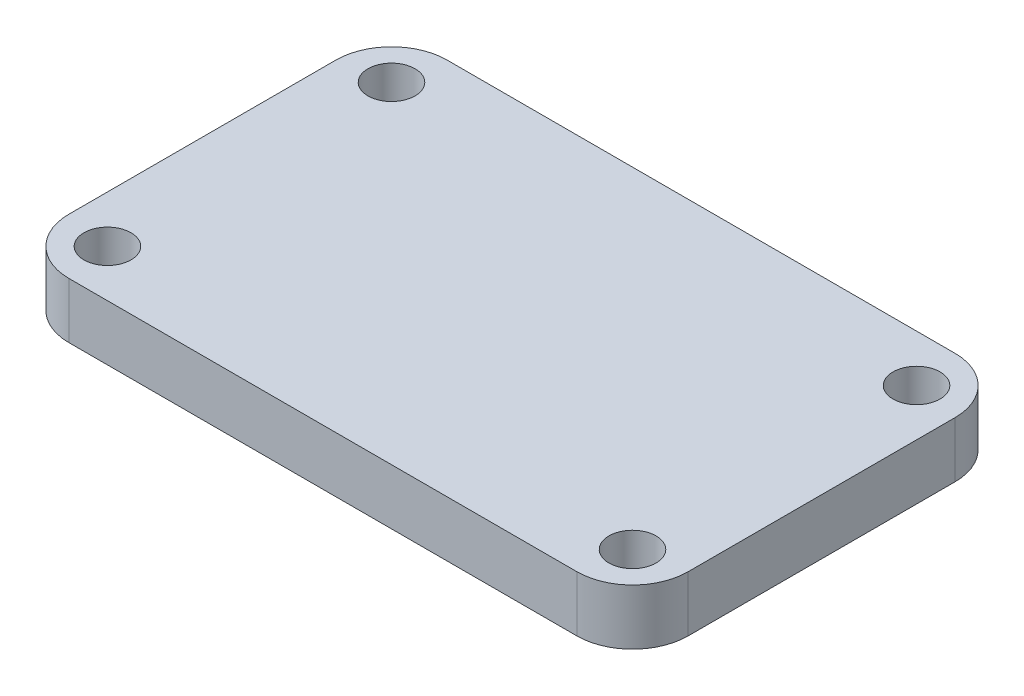
ISO-10303-21;
HEADER;
FILE_DESCRIPTION(('STEP AP214'),'2;1');
FILE_NAME('part.step','',(''),(''),'','','');
FILE_SCHEMA(('AUTOMOTIVE_DESIGN { 1 0 10303 214 1 1 1 1 }'));
ENDSEC;
DATA;
#1=APPLICATION_CONTEXT('core data for automotive mechanical design processes');
#2=APPLICATION_PROTOCOL_DEFINITION('international standard','automotive_design',2000,#1);
#3=PRODUCT_CONTEXT('',#1,'mechanical');
#4=PRODUCT('Part','Part','',(#3));
#5=PRODUCT_RELATED_PRODUCT_CATEGORY('part','',(#4));
#6=PRODUCT_DEFINITION_FORMATION('','',#4);
#7=PRODUCT_DEFINITION_CONTEXT('part definition',#1,'design');
#8=PRODUCT_DEFINITION('design','',#6,#7);
#9=PRODUCT_DEFINITION_SHAPE('','',#8);
#10=(LENGTH_UNIT() NAMED_UNIT(*) SI_UNIT(.MILLI.,.METRE.));
#11=(NAMED_UNIT(*) PLANE_ANGLE_UNIT() SI_UNIT($,.RADIAN.));
#12=(NAMED_UNIT(*) SI_UNIT($,.STERADIAN.) SOLID_ANGLE_UNIT());
#13=UNCERTAINTY_MEASURE_WITH_UNIT(LENGTH_MEASURE(1.E-05),#10,'distance_accuracy_value','');
#14=(GEOMETRIC_REPRESENTATION_CONTEXT(3) GLOBAL_UNCERTAINTY_ASSIGNED_CONTEXT((#13)) GLOBAL_UNIT_ASSIGNED_CONTEXT((#10,
#11,#12)) REPRESENTATION_CONTEXT('',''));
#15=CARTESIAN_POINT('',(0.,0.,0.));
#16=DIRECTION('',(0.,0.,1.));
#17=DIRECTION('',(1.,0.,0.));
#18=AXIS2_PLACEMENT_3D('',#15,#16,#17);
#19=CARTESIAN_POINT('',(33.3999999999999,3.,0.));
#20=DIRECTION('',(0.,0.,-1.));
#21=DIRECTION('',(-1.,0.,0.));
#22=AXIS2_PLACEMENT_3D('',#19,#20,#21);
#23=PLANE('',#22);
#24=DIRECTION('',(1.,0.,0.));
#25=VECTOR('',#24,1.);
#26=CARTESIAN_POINT('',(33.3999999999999,0.,0.));
#27=LINE('',#26,#25);
#28=CARTESIAN_POINT('',(2.99999999999999,0.,0.));
#29=VERTEX_POINT('',#28);
#30=CARTESIAN_POINT('',(30.3999999999999,0.,0.));
#31=VERTEX_POINT('',#30);
#32=EDGE_CURVE('E136',#29,#31,#27,.T.);
#33=ORIENTED_EDGE('',*,*,#32,.T.);
#34=DIRECTION('',(0.,-1.,0.));
#35=VECTOR('',#34,1.);
#36=CARTESIAN_POINT('',(30.3999999999999,3.,0.));
#37=LINE('',#36,#35);
#38=CARTESIAN_POINT('',(30.3999999999999,3.,0.));
#39=VERTEX_POINT('',#38);
#40=EDGE_CURVE('E111',#31,#39,#37,.F.);
#41=ORIENTED_EDGE('',*,*,#40,.T.);
#42=DIRECTION('',(1.,0.,0.));
#43=VECTOR('',#42,1.);
#44=CARTESIAN_POINT('',(33.3999999999999,3.,0.));
#45=LINE('',#44,#43);
#46=CARTESIAN_POINT('',(2.99999999999999,3.,0.));
#47=VERTEX_POINT('',#46);
#48=EDGE_CURVE('E149',#47,#39,#45,.T.);
#49=ORIENTED_EDGE('',*,*,#48,.F.);
#50=DIRECTION('',(0.,-1.,0.));
#51=VECTOR('',#50,1.);
#52=CARTESIAN_POINT('',(2.99999999999999,3.,0.));
#53=LINE('',#52,#51);
#54=EDGE_CURVE('E117',#47,#29,#53,.T.);
#55=ORIENTED_EDGE('',*,*,#54,.T.);
#56=EDGE_LOOP('',(#33,#41,#49,#55));
#57=FACE_BOUND('',#56,.T.);
#58=ADVANCED_FACE('F39',(#57),#23,.F.);
#59=CARTESIAN_POINT('',(33.3999999999999,3.,-20.4));
#60=DIRECTION('',(-1.,0.,0.));
#61=DIRECTION('',(0.,0.,1.));
#62=AXIS2_PLACEMENT_3D('',#59,#60,#61);
#63=PLANE('',#62);
#64=DIRECTION('',(0.,0.,-1.));
#65=VECTOR('',#64,1.);
#66=CARTESIAN_POINT('',(33.3999999999999,3.,-20.4));
#67=LINE('',#66,#65);
#68=CARTESIAN_POINT('',(33.3999999999999,3.,-3.));
#69=VERTEX_POINT('',#68);
#70=CARTESIAN_POINT('',(33.3999999999999,3.,-17.4));
#71=VERTEX_POINT('',#70);
#72=EDGE_CURVE('E127',#69,#71,#67,.T.);
#73=ORIENTED_EDGE('',*,*,#72,.F.);
#74=DIRECTION('',(0.,-1.,0.));
#75=VECTOR('',#74,1.);
#76=CARTESIAN_POINT('',(33.3999999999999,3.,-3.));
#77=LINE('',#76,#75);
#78=CARTESIAN_POINT('',(33.3999999999999,0.,-3.));
#79=VERTEX_POINT('',#78);
#80=EDGE_CURVE('E110',#69,#79,#77,.T.);
#81=ORIENTED_EDGE('',*,*,#80,.T.);
#82=DIRECTION('',(0.,0.,-1.));
#83=VECTOR('',#82,1.);
#84=CARTESIAN_POINT('',(33.3999999999999,0.,-20.4));
#85=LINE('',#84,#83);
#86=CARTESIAN_POINT('',(33.3999999999999,0.,-17.4));
#87=VERTEX_POINT('',#86);
#88=EDGE_CURVE('E124',#79,#87,#85,.T.);
#89=ORIENTED_EDGE('',*,*,#88,.T.);
#90=DIRECTION('',(0.,-1.,0.));
#91=VECTOR('',#90,1.);
#92=CARTESIAN_POINT('',(33.3999999999999,3.,-17.4));
#93=LINE('',#92,#91);
#94=EDGE_CURVE('E130',#87,#71,#93,.F.);
#95=ORIENTED_EDGE('',*,*,#94,.T.);
#96=EDGE_LOOP('',(#73,#81,#89,#95));
#97=FACE_BOUND('',#96,.T.);
#98=ADVANCED_FACE('F123',(#97),#63,.F.);
#99=CARTESIAN_POINT('',(0.,3.,-20.4));
#100=DIRECTION('',(0.,0.,1.));
#101=DIRECTION('',(1.,0.,0.));
#102=AXIS2_PLACEMENT_3D('',#99,#100,#101);
#103=PLANE('',#102);
#104=DIRECTION('',(-1.,0.,0.));
#105=VECTOR('',#104,1.);
#106=CARTESIAN_POINT('',(0.,3.,-20.4));
#107=LINE('',#106,#105);
#108=CARTESIAN_POINT('',(30.3999999999999,3.,-20.4));
#109=VERTEX_POINT('',#108);
#110=CARTESIAN_POINT('',(2.99999999999994,3.,-20.4));
#111=VERTEX_POINT('',#110);
#112=EDGE_CURVE('E185',#109,#111,#107,.T.);
#113=ORIENTED_EDGE('',*,*,#112,.F.);
#114=DIRECTION('',(0.,-1.,0.));
#115=VECTOR('',#114,1.);
#116=CARTESIAN_POINT('',(30.3999999999999,3.,-20.4));
#117=LINE('',#116,#115);
#118=CARTESIAN_POINT('',(30.3999999999999,0.,-20.4));
#119=VERTEX_POINT('',#118);
#120=EDGE_CURVE('E179',#109,#119,#117,.T.);
#121=ORIENTED_EDGE('',*,*,#120,.T.);
#122=DIRECTION('',(-1.,0.,0.));
#123=VECTOR('',#122,1.);
#124=CARTESIAN_POINT('',(0.,0.,-20.4));
#125=LINE('',#124,#123);
#126=CARTESIAN_POINT('',(2.99999999999994,0.,-20.4));
#127=VERTEX_POINT('',#126);
#128=EDGE_CURVE('E135',#119,#127,#125,.T.);
#129=ORIENTED_EDGE('',*,*,#128,.T.);
#130=DIRECTION('',(0.,-1.,0.));
#131=VECTOR('',#130,1.);
#132=CARTESIAN_POINT('',(2.99999999999994,3.,-20.4));
#133=LINE('',#132,#131);
#134=EDGE_CURVE('E176',#127,#111,#133,.F.);
#135=ORIENTED_EDGE('',*,*,#134,.T.);
#136=EDGE_LOOP('',(#113,#121,#129,#135));
#137=FACE_BOUND('',#136,.T.);
#138=ADVANCED_FACE('F260',(#137),#103,.F.);
#139=CARTESIAN_POINT('',(0.,3.,0.));
#140=DIRECTION('',(1.,0.,0.));
#141=DIRECTION('',(0.,0.,-1.));
#142=AXIS2_PLACEMENT_3D('',#139,#140,#141);
#143=PLANE('',#142);
#144=DIRECTION('',(0.,0.,1.));
#145=VECTOR('',#144,1.);
#146=CARTESIAN_POINT('',(0.,3.,0.));
#147=LINE('',#146,#145);
#148=CARTESIAN_POINT('',(0.,3.,-17.4));
#149=VERTEX_POINT('',#148);
#150=CARTESIAN_POINT('',(0.,3.,-2.99999999999999));
#151=VERTEX_POINT('',#150);
#152=EDGE_CURVE('E151',#149,#151,#147,.T.);
#153=ORIENTED_EDGE('',*,*,#152,.F.);
#154=DIRECTION('',(0.,-1.,0.));
#155=VECTOR('',#154,1.);
#156=CARTESIAN_POINT('',(0.,3.,-17.4));
#157=LINE('',#156,#155);
#158=CARTESIAN_POINT('',(0.,0.,-17.4));
#159=VERTEX_POINT('',#158);
#160=EDGE_CURVE('E11',#149,#159,#157,.T.);
#161=ORIENTED_EDGE('',*,*,#160,.T.);
#162=DIRECTION('',(0.,0.,1.));
#163=VECTOR('',#162,1.);
#164=CARTESIAN_POINT('',(0.,0.,0.));
#165=LINE('',#164,#163);
#166=CARTESIAN_POINT('',(0.,0.,-2.99999999999999));
#167=VERTEX_POINT('',#166);
#168=EDGE_CURVE('E141',#159,#167,#165,.T.);
#169=ORIENTED_EDGE('',*,*,#168,.T.);
#170=DIRECTION('',(0.,-1.,0.));
#171=VECTOR('',#170,1.);
#172=CARTESIAN_POINT('',(0.,3.,-2.99999999999999));
#173=LINE('',#172,#171);
#174=EDGE_CURVE('E48',#167,#151,#173,.F.);
#175=ORIENTED_EDGE('',*,*,#174,.T.);
#176=EDGE_LOOP('',(#153,#161,#169,#175));
#177=FACE_BOUND('',#176,.T.);
#178=ADVANCED_FACE('F239',(#177),#143,.F.);
#179=CARTESIAN_POINT('',(0.,3.,0.));
#180=DIRECTION('',(0.,-1.,0.));
#181=DIRECTION('',(0.,0.,-1.));
#182=AXIS2_PLACEMENT_3D('',#179,#180,#181);
#183=PLANE('',#182);
#184=CARTESIAN_POINT('',(30.8599999999999,3.,-17.86));
#185=DIRECTION('',(0.,1.,0.));
#186=DIRECTION('',(0.,0.,1.));
#187=AXIS2_PLACEMENT_3D('',#184,#185,#186);
#188=CIRCLE('',#187,1.27);
#189=CARTESIAN_POINT('',(30.8599999999999,3.,-16.59));
#190=VERTEX_POINT('',#189);
#191=EDGE_CURVE('E202',#190,#190,#188,.T.);
#192=ORIENTED_EDGE('',*,*,#191,.F.);
#193=EDGE_LOOP('',(#192));
#194=FACE_BOUND('',#193,.T.);
#195=CARTESIAN_POINT('',(30.8599999999999,3.,-2.54));
#196=DIRECTION('',(0.,1.,0.));
#197=DIRECTION('',(0.,0.,1.));
#198=AXIS2_PLACEMENT_3D('',#195,#196,#197);
#199=CIRCLE('',#198,1.27);
#200=CARTESIAN_POINT('',(30.8599999999999,3.,-1.27));
#201=VERTEX_POINT('',#200);
#202=EDGE_CURVE('E210',#201,#201,#199,.T.);
#203=ORIENTED_EDGE('',*,*,#202,.F.);
#204=EDGE_LOOP('',(#203));
#205=FACE_BOUND('',#204,.T.);
#206=CARTESIAN_POINT('',(2.54,3.,-2.54));
#207=DIRECTION('',(0.,1.,0.));
#208=DIRECTION('',(0.,0.,1.));
#209=AXIS2_PLACEMENT_3D('',#206,#207,#208);
#210=CIRCLE('',#209,1.27);
#211=CARTESIAN_POINT('',(2.54,3.,-1.27));
#212=VERTEX_POINT('',#211);
#213=EDGE_CURVE('E218',#212,#212,#210,.T.);
#214=ORIENTED_EDGE('',*,*,#213,.F.);
#215=EDGE_LOOP('',(#214));
#216=FACE_BOUND('',#215,.T.);
#217=CARTESIAN_POINT('',(2.53999999999993,3.,-17.86));
#218=DIRECTION('',(0.,1.,0.));
#219=DIRECTION('',(0.,0.,1.));
#220=AXIS2_PLACEMENT_3D('',#217,#218,#219);
#221=CIRCLE('',#220,1.27);
#222=CARTESIAN_POINT('',(2.53999999999993,3.,-16.59));
#223=VERTEX_POINT('',#222);
#224=EDGE_CURVE('E194',#223,#223,#221,.T.);
#225=ORIENTED_EDGE('',*,*,#224,.F.);
#226=EDGE_LOOP('',(#225));
#227=FACE_BOUND('',#226,.T.);
#228=ORIENTED_EDGE('',*,*,#48,.T.);
#229=CARTESIAN_POINT('',(30.3999999999999,3.,-3.));
#230=DIRECTION('',(0.,-1.,0.));
#231=DIRECTION('',(0.,0.,-1.));
#232=AXIS2_PLACEMENT_3D('',#229,#230,#231);
#233=CIRCLE('',#232,3.);
#234=EDGE_CURVE('E173',#39,#69,#233,.F.);
#235=ORIENTED_EDGE('',*,*,#234,.T.);
#236=ORIENTED_EDGE('',*,*,#72,.T.);
#237=CARTESIAN_POINT('',(30.3999999999999,3.,-17.4));
#238=DIRECTION('',(0.,-1.,0.));
#239=DIRECTION('',(0.,0.,-1.));
#240=AXIS2_PLACEMENT_3D('',#237,#238,#239);
#241=CIRCLE('',#240,3.);
#242=EDGE_CURVE('E170',#71,#109,#241,.F.);
#243=ORIENTED_EDGE('',*,*,#242,.T.);
#244=ORIENTED_EDGE('',*,*,#112,.T.);
#245=CARTESIAN_POINT('',(2.99999999999994,3.,-17.4));
#246=DIRECTION('',(0.,-1.,0.));
#247=DIRECTION('',(0.,0.,-1.));
#248=AXIS2_PLACEMENT_3D('',#245,#246,#247);
#249=CIRCLE('',#248,3.);
#250=EDGE_CURVE('E61',#111,#149,#249,.F.);
#251=ORIENTED_EDGE('',*,*,#250,.T.);
#252=ORIENTED_EDGE('',*,*,#152,.T.);
#253=CARTESIAN_POINT('',(2.99999999999999,3.,-3.));
#254=DIRECTION('',(0.,-1.,0.));
#255=DIRECTION('',(0.,0.,-1.));
#256=AXIS2_PLACEMENT_3D('',#253,#254,#255);
#257=CIRCLE('',#256,3.);
#258=EDGE_CURVE('E165',#151,#47,#257,.F.);
#259=ORIENTED_EDGE('',*,*,#258,.T.);
#260=EDGE_LOOP('',(#228,#235,#236,#243,#244,#251,#252,#259));
#261=FACE_BOUND('',#260,.T.);
#262=ADVANCED_FACE('F236',(#194,#205,#216,#227,#261),#183,.F.);
#263=CARTESIAN_POINT('',(0.,0.,0.));
#264=DIRECTION('',(0.,-1.,0.));
#265=DIRECTION('',(0.,0.,-1.));
#266=AXIS2_PLACEMENT_3D('',#263,#264,#265);
#267=PLANE('',#266);
#268=CARTESIAN_POINT('',(30.8599999999999,0.,-17.86));
#269=DIRECTION('',(0.,1.,0.));
#270=DIRECTION('',(0.,0.,1.));
#271=AXIS2_PLACEMENT_3D('',#268,#269,#270);
#272=CIRCLE('',#271,1.27);
#273=CARTESIAN_POINT('',(30.8599999999999,0.,-16.59));
#274=VERTEX_POINT('',#273);
#275=EDGE_CURVE('E206',#274,#274,#272,.T.);
#276=ORIENTED_EDGE('',*,*,#275,.T.);
#277=EDGE_LOOP('',(#276));
#278=FACE_BOUND('',#277,.T.);
#279=CARTESIAN_POINT('',(30.8599999999999,0.,-2.54));
#280=DIRECTION('',(0.,1.,0.));
#281=DIRECTION('',(0.,0.,1.));
#282=AXIS2_PLACEMENT_3D('',#279,#280,#281);
#283=CIRCLE('',#282,1.27);
#284=CARTESIAN_POINT('',(30.8599999999999,0.,-1.27));
#285=VERTEX_POINT('',#284);
#286=EDGE_CURVE('E214',#285,#285,#283,.T.);
#287=ORIENTED_EDGE('',*,*,#286,.T.);
#288=EDGE_LOOP('',(#287));
#289=FACE_BOUND('',#288,.T.);
#290=CARTESIAN_POINT('',(2.54,0.,-2.54));
#291=DIRECTION('',(0.,1.,0.));
#292=DIRECTION('',(0.,0.,1.));
#293=AXIS2_PLACEMENT_3D('',#290,#291,#292);
#294=CIRCLE('',#293,1.27);
#295=CARTESIAN_POINT('',(2.54,0.,-1.27));
#296=VERTEX_POINT('',#295);
#297=EDGE_CURVE('E198',#296,#296,#294,.T.);
#298=ORIENTED_EDGE('',*,*,#297,.T.);
#299=EDGE_LOOP('',(#298));
#300=FACE_BOUND('',#299,.T.);
#301=CARTESIAN_POINT('',(2.53999999999993,0.,-17.86));
#302=DIRECTION('',(0.,1.,0.));
#303=DIRECTION('',(0.,0.,1.));
#304=AXIS2_PLACEMENT_3D('',#301,#302,#303);
#305=CIRCLE('',#304,1.27);
#306=CARTESIAN_POINT('',(2.53999999999993,0.,-16.59));
#307=VERTEX_POINT('',#306);
#308=EDGE_CURVE('E143',#307,#307,#305,.T.);
#309=ORIENTED_EDGE('',*,*,#308,.T.);
#310=EDGE_LOOP('',(#309));
#311=FACE_BOUND('',#310,.T.);
#312=ORIENTED_EDGE('',*,*,#88,.F.);
#313=CARTESIAN_POINT('',(30.3999999999999,0.,-3.));
#314=DIRECTION('',(0.,-1.,0.));
#315=DIRECTION('',(0.,0.,-1.));
#316=AXIS2_PLACEMENT_3D('',#313,#314,#315);
#317=CIRCLE('',#316,3.);
#318=EDGE_CURVE('E106',#79,#31,#317,.T.);
#319=ORIENTED_EDGE('',*,*,#318,.T.);
#320=ORIENTED_EDGE('',*,*,#32,.F.);
#321=CARTESIAN_POINT('',(2.99999999999999,0.,-3.));
#322=DIRECTION('',(0.,-1.,0.));
#323=DIRECTION('',(0.,0.,-1.));
#324=AXIS2_PLACEMENT_3D('',#321,#322,#323);
#325=CIRCLE('',#324,3.);
#326=EDGE_CURVE('E129',#29,#167,#325,.T.);
#327=ORIENTED_EDGE('',*,*,#326,.T.);
#328=ORIENTED_EDGE('',*,*,#168,.F.);
#329=CARTESIAN_POINT('',(2.99999999999994,0.,-17.4));
#330=DIRECTION('',(0.,-1.,0.));
#331=DIRECTION('',(0.,0.,-1.));
#332=AXIS2_PLACEMENT_3D('',#329,#330,#331);
#333=CIRCLE('',#332,3.);
#334=EDGE_CURVE('E155',#159,#127,#333,.T.);
#335=ORIENTED_EDGE('',*,*,#334,.T.);
#336=ORIENTED_EDGE('',*,*,#128,.F.);
#337=CARTESIAN_POINT('',(30.3999999999999,0.,-17.4));
#338=DIRECTION('',(0.,-1.,0.));
#339=DIRECTION('',(0.,0.,-1.));
#340=AXIS2_PLACEMENT_3D('',#337,#338,#339);
#341=CIRCLE('',#340,3.);
#342=EDGE_CURVE('E118',#119,#87,#341,.T.);
#343=ORIENTED_EDGE('',*,*,#342,.T.);
#344=EDGE_LOOP('',(#312,#319,#320,#327,#328,#335,#336,#343));
#345=FACE_BOUND('',#344,.T.);
#346=ADVANCED_FACE('F132',(#278,#289,#300,#311,#345),#267,.T.);
#347=CARTESIAN_POINT('',(2.53999999999993,0.,-17.86));
#348=DIRECTION('',(0.,1.,0.));
#349=DIRECTION('',(0.,0.,1.));
#350=AXIS2_PLACEMENT_3D('',#347,#348,#349);
#351=CYLINDRICAL_SURFACE('',#350,1.27);
#352=ORIENTED_EDGE('',*,*,#308,.F.);
#353=EDGE_LOOP('',(#352));
#354=FACE_BOUND('',#353,.T.);
#355=ORIENTED_EDGE('',*,*,#224,.T.);
#356=EDGE_LOOP('',(#355));
#357=FACE_BOUND('',#356,.T.);
#358=ADVANCED_FACE('F232',(#354,#357),#351,.F.);
#359=CARTESIAN_POINT('',(2.54,0.,-2.54));
#360=DIRECTION('',(0.,1.,0.));
#361=DIRECTION('',(0.,0.,1.));
#362=AXIS2_PLACEMENT_3D('',#359,#360,#361);
#363=CYLINDRICAL_SURFACE('',#362,1.27);
#364=ORIENTED_EDGE('',*,*,#297,.F.);
#365=EDGE_LOOP('',(#364));
#366=FACE_BOUND('',#365,.T.);
#367=ORIENTED_EDGE('',*,*,#213,.T.);
#368=EDGE_LOOP('',(#367));
#369=FACE_BOUND('',#368,.T.);
#370=ADVANCED_FACE('F228',(#366,#369),#363,.F.);
#371=CARTESIAN_POINT('',(30.8599999999999,0.,-2.54));
#372=DIRECTION('',(0.,1.,0.));
#373=DIRECTION('',(0.,0.,1.));
#374=AXIS2_PLACEMENT_3D('',#371,#372,#373);
#375=CYLINDRICAL_SURFACE('',#374,1.27);
#376=ORIENTED_EDGE('',*,*,#286,.F.);
#377=EDGE_LOOP('',(#376));
#378=FACE_BOUND('',#377,.T.);
#379=ORIENTED_EDGE('',*,*,#202,.T.);
#380=EDGE_LOOP('',(#379));
#381=FACE_BOUND('',#380,.T.);
#382=ADVANCED_FACE('F231',(#378,#381),#375,.F.);
#383=CARTESIAN_POINT('',(30.8599999999999,0.,-17.86));
#384=DIRECTION('',(0.,1.,0.));
#385=DIRECTION('',(0.,0.,1.));
#386=AXIS2_PLACEMENT_3D('',#383,#384,#385);
#387=CYLINDRICAL_SURFACE('',#386,1.27);
#388=ORIENTED_EDGE('',*,*,#275,.F.);
#389=EDGE_LOOP('',(#388));
#390=FACE_BOUND('',#389,.T.);
#391=ORIENTED_EDGE('',*,*,#191,.T.);
#392=EDGE_LOOP('',(#391));
#393=FACE_BOUND('',#392,.T.);
#394=ADVANCED_FACE('F267',(#390,#393),#387,.F.);
#395=CARTESIAN_POINT('',(30.3999999999999,3.,-3.));
#396=DIRECTION('',(0.,-1.,0.));
#397=DIRECTION('',(0.,0.,-1.));
#398=AXIS2_PLACEMENT_3D('',#395,#396,#397);
#399=CYLINDRICAL_SURFACE('',#398,3.);
#400=ORIENTED_EDGE('',*,*,#234,.F.);
#401=ORIENTED_EDGE('',*,*,#40,.F.);
#402=ORIENTED_EDGE('',*,*,#318,.F.);
#403=ORIENTED_EDGE('',*,*,#80,.F.);
#404=EDGE_LOOP('',(#400,#401,#402,#403));
#405=FACE_BOUND('',#404,.T.);
#406=ADVANCED_FACE('F109',(#405),#399,.T.);
#407=CARTESIAN_POINT('',(30.3999999999999,3.,-17.4));
#408=DIRECTION('',(0.,-1.,0.));
#409=DIRECTION('',(0.,0.,-1.));
#410=AXIS2_PLACEMENT_3D('',#407,#408,#409);
#411=CYLINDRICAL_SURFACE('',#410,3.);
#412=ORIENTED_EDGE('',*,*,#242,.F.);
#413=ORIENTED_EDGE('',*,*,#94,.F.);
#414=ORIENTED_EDGE('',*,*,#342,.F.);
#415=ORIENTED_EDGE('',*,*,#120,.F.);
#416=EDGE_LOOP('',(#412,#413,#414,#415));
#417=FACE_BOUND('',#416,.T.);
#418=ADVANCED_FACE('F266',(#417),#411,.T.);
#419=CARTESIAN_POINT('',(2.99999999999994,3.,-17.4));
#420=DIRECTION('',(0.,-1.,0.));
#421=DIRECTION('',(0.,0.,-1.));
#422=AXIS2_PLACEMENT_3D('',#419,#420,#421);
#423=CYLINDRICAL_SURFACE('',#422,3.);
#424=ORIENTED_EDGE('',*,*,#250,.F.);
#425=ORIENTED_EDGE('',*,*,#134,.F.);
#426=ORIENTED_EDGE('',*,*,#334,.F.);
#427=ORIENTED_EDGE('',*,*,#160,.F.);
#428=EDGE_LOOP('',(#424,#425,#426,#427));
#429=FACE_BOUND('',#428,.T.);
#430=ADVANCED_FACE('F269',(#429),#423,.T.);
#431=CARTESIAN_POINT('',(2.99999999999999,3.,-3.));
#432=DIRECTION('',(0.,-1.,0.));
#433=DIRECTION('',(0.,0.,-1.));
#434=AXIS2_PLACEMENT_3D('',#431,#432,#433);
#435=CYLINDRICAL_SURFACE('',#434,3.);
#436=ORIENTED_EDGE('',*,*,#258,.F.);
#437=ORIENTED_EDGE('',*,*,#174,.F.);
#438=ORIENTED_EDGE('',*,*,#326,.F.);
#439=ORIENTED_EDGE('',*,*,#54,.F.);
#440=EDGE_LOOP('',(#436,#437,#438,#439));
#441=FACE_BOUND('',#440,.T.);
#442=ADVANCED_FACE('F41',(#441),#435,.T.);
#443=CLOSED_SHELL('',(#58,#98,#138,#178,#262,#346,#358,#370,#382,#394,#406,#418,#430,#442));
#444=MANIFOLD_SOLID_BREP('B2',#443);
#445=ADVANCED_BREP_SHAPE_REPRESENTATION('',(#18,#444),#14);
#446=SHAPE_DEFINITION_REPRESENTATION(#9,#445);
ENDSEC;
END-ISO-10303-21;
